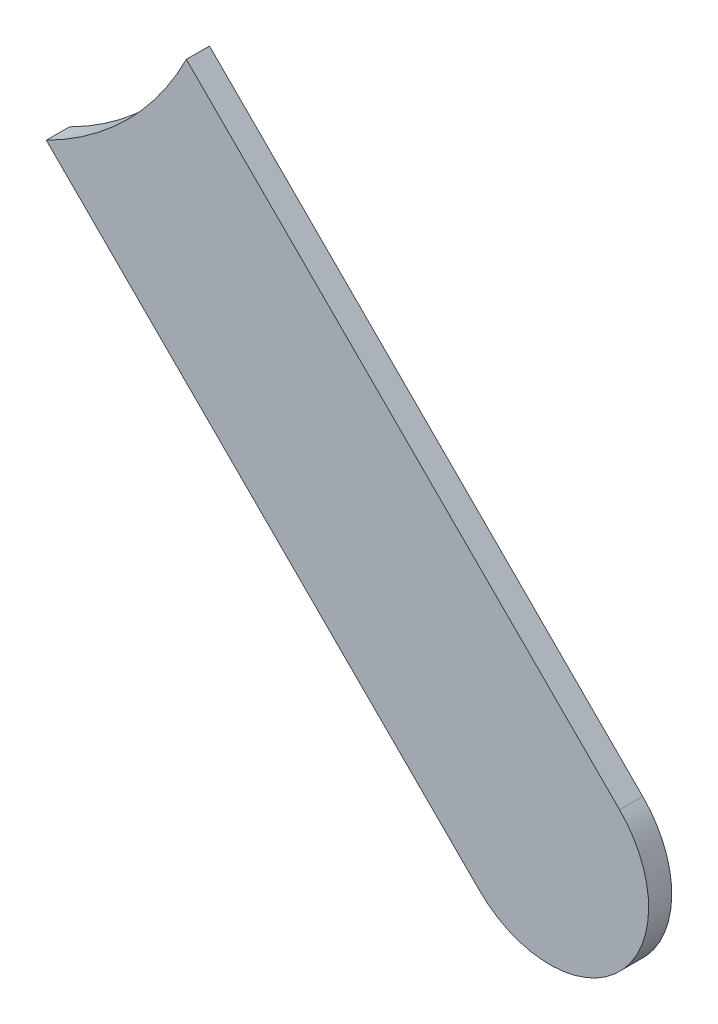
ISO-10303-21;
HEADER;
FILE_DESCRIPTION(('STEP AP214'),'2;1');
FILE_NAME('part.step','',(''),(''),'','','');
FILE_SCHEMA(('AUTOMOTIVE_DESIGN { 1 0 10303 214 1 1 1 1 }'));
ENDSEC;
DATA;
#1=APPLICATION_CONTEXT('core data for automotive mechanical design processes');
#2=APPLICATION_PROTOCOL_DEFINITION('international standard','automotive_design',2000,#1);
#3=PRODUCT_CONTEXT('',#1,'mechanical');
#4=PRODUCT('Part','Part','',(#3));
#5=PRODUCT_RELATED_PRODUCT_CATEGORY('part','',(#4));
#6=PRODUCT_DEFINITION_FORMATION('','',#4);
#7=PRODUCT_DEFINITION_CONTEXT('part definition',#1,'design');
#8=PRODUCT_DEFINITION('design','',#6,#7);
#9=PRODUCT_DEFINITION_SHAPE('','',#8);
#10=(LENGTH_UNIT() NAMED_UNIT(*) SI_UNIT(.MILLI.,.METRE.));
#11=(NAMED_UNIT(*) PLANE_ANGLE_UNIT() SI_UNIT($,.RADIAN.));
#12=(NAMED_UNIT(*) SI_UNIT($,.STERADIAN.) SOLID_ANGLE_UNIT());
#13=UNCERTAINTY_MEASURE_WITH_UNIT(LENGTH_MEASURE(1.E-05),#10,'distance_accuracy_value','');
#14=(GEOMETRIC_REPRESENTATION_CONTEXT(3) GLOBAL_UNCERTAINTY_ASSIGNED_CONTEXT((#13)) GLOBAL_UNIT_ASSIGNED_CONTEXT((#10,
#11,#12)) REPRESENTATION_CONTEXT('',''));
#15=CARTESIAN_POINT('',(0.,0.,0.));
#16=DIRECTION('',(0.,0.,1.));
#17=DIRECTION('',(1.,0.,0.));
#18=AXIS2_PLACEMENT_3D('',#15,#16,#17);
#19=CARTESIAN_POINT('',(81.158933,-124.721066,1.6));
#20=DIRECTION('',(0.707106781186548,0.707106781186548,0.));
#21=DIRECTION('',(0.,0.,-1.));
#22=AXIS2_PLACEMENT_3D('',#19,#20,#21);
#23=PLANE('',#22);
#24=DIRECTION('',(0.,0.,1.));
#25=VECTOR('',#24,1.);
#26=CARTESIAN_POINT('',(82.133933,-125.696066,1.6));
#27=LINE('',#26,#25);
#28=CARTESIAN_POINT('',(82.133933,-125.696066,1.6));
#29=VERTEX_POINT('',#28);
#30=CARTESIAN_POINT('',(82.133933,-125.696066,1.635));
#31=VERTEX_POINT('',#30);
#32=EDGE_CURVE('E11',#29,#31,#27,.T.);
#33=ORIENTED_EDGE('',*,*,#32,.T.);
#34=DIRECTION('',(0.707106781186548,-0.707106781186548,0.));
#35=VECTOR('',#34,1.);
#36=CARTESIAN_POINT('',(81.158933,-124.721066,1.635));
#37=LINE('',#36,#35);
#38=CARTESIAN_POINT('',(81.477622058904,-125.0397550589,1.635));
#39=VERTEX_POINT('',#38);
#40=EDGE_CURVE('E25',#39,#31,#37,.T.);
#41=ORIENTED_EDGE('',*,*,#40,.F.);
#42=DIRECTION('',(0.,0.,-1.));
#43=VECTOR('',#42,1.);
#44=CARTESIAN_POINT('',(81.477622058906,-125.0397550589,-0.045));
#45=LINE('',#44,#43);
#46=CARTESIAN_POINT('',(81.477622058904,-125.0397550589,1.6));
#47=VERTEX_POINT('',#46);
#48=EDGE_CURVE('E64',#39,#47,#45,.T.);
#49=ORIENTED_EDGE('',*,*,#48,.T.);
#50=DIRECTION('',(0.707106781186548,-0.707106781186548,0.));
#51=VECTOR('',#50,1.);
#52=CARTESIAN_POINT('',(81.158933,-124.721066,1.6));
#53=LINE('',#52,#51);
#54=EDGE_CURVE('E67',#47,#29,#53,.T.);
#55=ORIENTED_EDGE('',*,*,#54,.T.);
#56=EDGE_LOOP('',(#33,#41,#49,#55));
#57=FACE_BOUND('',#56,.T.);
#58=ADVANCED_FACE('F17',(#57),#23,.F.);
#59=CARTESIAN_POINT('',(82.2399995,-125.5899995,1.6));
#60=DIRECTION('',(0.,0.,-1.));
#61=DIRECTION('',(-0.707106781186548,-0.707106781186548,0.));
#62=AXIS2_PLACEMENT_3D('',#59,#60,#61);
#63=CYLINDRICAL_SURFACE('',#62,0.150000682813);
#64=CARTESIAN_POINT('',(82.2399995,-125.5899995,1.6));
#65=DIRECTION('',(0.,0.,1.));
#66=DIRECTION('',(-0.707106781186548,-0.707106781186548,0.));
#67=AXIS2_PLACEMENT_3D('',#64,#65,#66);
#68=CIRCLE('',#67,0.150000682813);
#69=CARTESIAN_POINT('',(82.346066,-125.483933,1.6));
#70=VERTEX_POINT('',#69);
#71=EDGE_CURVE('E82',#29,#70,#68,.T.);
#72=ORIENTED_EDGE('',*,*,#71,.T.);
#73=DIRECTION('',(0.,0.,1.));
#74=VECTOR('',#73,1.);
#75=CARTESIAN_POINT('',(82.346066,-125.483933,1.6));
#76=LINE('',#75,#74);
#77=CARTESIAN_POINT('',(82.346066,-125.483933,1.635));
#78=VERTEX_POINT('',#77);
#79=EDGE_CURVE('E93',#70,#78,#76,.T.);
#80=ORIENTED_EDGE('',*,*,#79,.T.);
#81=CARTESIAN_POINT('',(82.2399995,-125.5899995,1.635));
#82=DIRECTION('',(0.,0.,1.));
#83=DIRECTION('',(-0.707106781186548,-0.707106781186548,0.));
#84=AXIS2_PLACEMENT_3D('',#81,#82,#83);
#85=CIRCLE('',#84,0.150000682813);
#86=EDGE_CURVE('E71',#31,#78,#85,.T.);
#87=ORIENTED_EDGE('',*,*,#86,.F.);
#88=ORIENTED_EDGE('',*,*,#32,.F.);
#89=EDGE_LOOP('',(#72,#80,#87,#88));
#90=FACE_BOUND('',#89,.T.);
#91=ADVANCED_FACE('F122',(#90),#63,.T.);
#92=CARTESIAN_POINT('',(82.346066,-125.483933,1.635));
#93=DIRECTION('',(0.,0.,1.));
#94=DIRECTION('',(1.,0.,0.));
#95=AXIS2_PLACEMENT_3D('',#92,#93,#94);
#96=PLANE('',#95);
#97=ORIENTED_EDGE('',*,*,#86,.T.);
#98=DIRECTION('',(-0.707106781186548,0.707106781186548,0.));
#99=VECTOR('',#98,1.);
#100=CARTESIAN_POINT('',(82.346066,-125.483933,1.635));
#101=LINE('',#100,#99);
#102=CARTESIAN_POINT('',(81.689755058903,-124.8276220589,1.635));
#103=VERTEX_POINT('',#102);
#104=EDGE_CURVE('E112',#78,#103,#101,.T.);
#105=ORIENTED_EDGE('',*,*,#104,.T.);
#106=CARTESIAN_POINT('',(81.265,-124.615,1.635));
#107=DIRECTION('',(0.,0.,-1.));
#108=DIRECTION('',(0.,-1.,0.));
#109=AXIS2_PLACEMENT_3D('',#106,#107,#108);
#110=CIRCLE('',#109,0.475);
#111=EDGE_CURVE('E72',#103,#39,#110,.T.);
#112=ORIENTED_EDGE('',*,*,#111,.T.);
#113=ORIENTED_EDGE('',*,*,#40,.T.);
#114=EDGE_LOOP('',(#97,#105,#112,#113));
#115=FACE_BOUND('',#114,.T.);
#116=ADVANCED_FACE('F125',(#115),#96,.T.);
#117=CARTESIAN_POINT('',(81.265,-124.615,-0.045));
#118=DIRECTION('',(0.,0.,-1.));
#119=DIRECTION('',(0.,-1.,0.));
#120=AXIS2_PLACEMENT_3D('',#117,#118,#119);
#121=CYLINDRICAL_SURFACE('',#120,0.475);
#122=ORIENTED_EDGE('',*,*,#111,.F.);
#123=DIRECTION('',(0.,0.,-1.));
#124=VECTOR('',#123,1.);
#125=CARTESIAN_POINT('',(81.689755058906,-124.8276220589,-0.045));
#126=LINE('',#125,#124);
#127=CARTESIAN_POINT('',(81.689755058903,-124.8276220589,1.6));
#128=VERTEX_POINT('',#127);
#129=EDGE_CURVE('E77',#103,#128,#126,.T.);
#130=ORIENTED_EDGE('',*,*,#129,.T.);
#131=CARTESIAN_POINT('',(81.265,-124.615,1.6));
#132=DIRECTION('',(0.,0.,-1.));
#133=DIRECTION('',(0.,-1.,0.));
#134=AXIS2_PLACEMENT_3D('',#131,#132,#133);
#135=CIRCLE('',#134,0.475);
#136=EDGE_CURVE('E74',#128,#47,#135,.T.);
#137=ORIENTED_EDGE('',*,*,#136,.T.);
#138=ORIENTED_EDGE('',*,*,#48,.F.);
#139=EDGE_LOOP('',(#122,#130,#137,#138));
#140=FACE_BOUND('',#139,.T.);
#141=ADVANCED_FACE('F75',(#140),#121,.F.);
#142=CARTESIAN_POINT('',(82.346066,-125.483933,1.6));
#143=DIRECTION('',(0.,0.,1.));
#144=DIRECTION('',(1.,0.,0.));
#145=AXIS2_PLACEMENT_3D('',#142,#143,#144);
#146=PLANE('',#145);
#147=ORIENTED_EDGE('',*,*,#54,.F.);
#148=ORIENTED_EDGE('',*,*,#136,.F.);
#149=DIRECTION('',(-0.707106781186548,0.707106781186548,0.));
#150=VECTOR('',#149,1.);
#151=CARTESIAN_POINT('',(82.346066,-125.483933,1.6));
#152=LINE('',#151,#150);
#153=EDGE_CURVE('E87',#70,#128,#152,.T.);
#154=ORIENTED_EDGE('',*,*,#153,.F.);
#155=ORIENTED_EDGE('',*,*,#71,.F.);
#156=EDGE_LOOP('',(#147,#148,#154,#155));
#157=FACE_BOUND('',#156,.T.);
#158=ADVANCED_FACE('F85',(#157),#146,.F.);
#159=CARTESIAN_POINT('',(82.346066,-125.483933,1.6));
#160=DIRECTION('',(-0.707106781186548,-0.707106781186548,0.));
#161=DIRECTION('',(-0.707106781186548,0.707106781186548,0.));
#162=AXIS2_PLACEMENT_3D('',#159,#160,#161);
#163=PLANE('',#162);
#164=ORIENTED_EDGE('',*,*,#129,.F.);
#165=ORIENTED_EDGE('',*,*,#104,.F.);
#166=ORIENTED_EDGE('',*,*,#79,.F.);
#167=ORIENTED_EDGE('',*,*,#153,.T.);
#168=EDGE_LOOP('',(#164,#165,#166,#167));
#169=FACE_BOUND('',#168,.T.);
#170=ADVANCED_FACE('F124',(#169),#163,.F.);
#171=CLOSED_SHELL('',(#58,#91,#116,#141,#158,#170));
#172=MANIFOLD_SOLID_BREP('B1',#171);
#173=ADVANCED_BREP_SHAPE_REPRESENTATION('',(#18,#172),#14);
#174=SHAPE_DEFINITION_REPRESENTATION(#9,#173);
ENDSEC;
END-ISO-10303-21;
